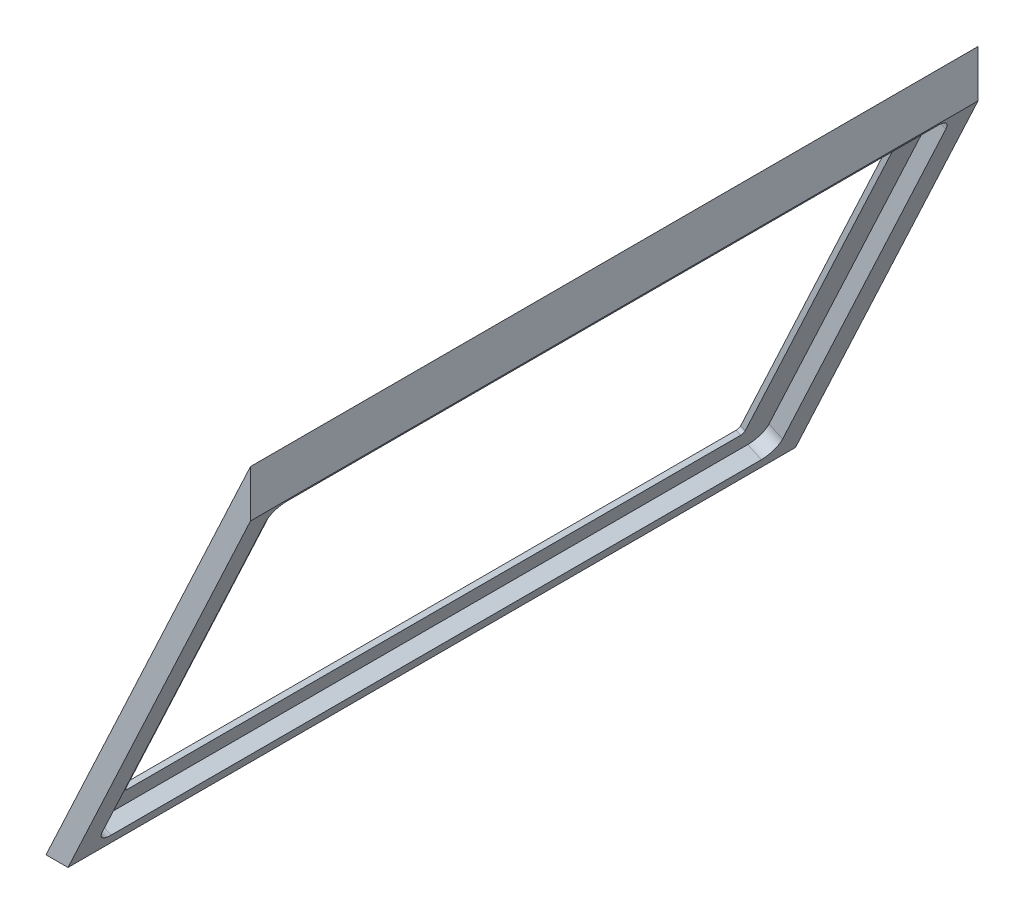
ISO-10303-21;
HEADER;
FILE_DESCRIPTION(('STEP AP214'),'2;1');
FILE_NAME('part.step','',(''),(''),'','','');
FILE_SCHEMA(('AUTOMOTIVE_DESIGN { 1 0 10303 214 1 1 1 1 }'));
ENDSEC;
DATA;
#1=APPLICATION_CONTEXT('core data for automotive mechanical design processes');
#2=APPLICATION_PROTOCOL_DEFINITION('international standard','automotive_design',2000,#1);
#3=PRODUCT_CONTEXT('',#1,'mechanical');
#4=PRODUCT('Part','Part','',(#3));
#5=PRODUCT_RELATED_PRODUCT_CATEGORY('part','',(#4));
#6=PRODUCT_DEFINITION_FORMATION('','',#4);
#7=PRODUCT_DEFINITION_CONTEXT('part definition',#1,'design');
#8=PRODUCT_DEFINITION('design','',#6,#7);
#9=PRODUCT_DEFINITION_SHAPE('','',#8);
#10=(LENGTH_UNIT() NAMED_UNIT(*) SI_UNIT(.MILLI.,.METRE.));
#11=(NAMED_UNIT(*) PLANE_ANGLE_UNIT() SI_UNIT($,.RADIAN.));
#12=(NAMED_UNIT(*) SI_UNIT($,.STERADIAN.) SOLID_ANGLE_UNIT());
#13=UNCERTAINTY_MEASURE_WITH_UNIT(LENGTH_MEASURE(1.E-05),#10,'distance_accuracy_value','');
#14=(GEOMETRIC_REPRESENTATION_CONTEXT(3) GLOBAL_UNCERTAINTY_ASSIGNED_CONTEXT((#13)) GLOBAL_UNIT_ASSIGNED_CONTEXT((#10,
#11,#12)) REPRESENTATION_CONTEXT('',''));
#15=CARTESIAN_POINT('',(0.,0.,0.));
#16=DIRECTION('',(0.,0.,1.));
#17=DIRECTION('',(1.,0.,0.));
#18=AXIS2_PLACEMENT_3D('',#15,#16,#17);
#19=CARTESIAN_POINT('',(60.2477013968429,-10.5015319165965,-97.6629999999999));
#20=DIRECTION('',(-0.906307787036651,0.422618261740697,0.));
#21=DIRECTION('',(-0.422618261740697,-0.906307787036651,0.));
#22=AXIS2_PLACEMENT_3D('',#19,#20,#21);
#23=CYLINDRICAL_SURFACE('',#22,1.016);
#24=CARTESIAN_POINT('',(8.17705624087686,13.7794086847018,-97.6629999999999));
#25=DIRECTION('',(0.906307787036651,-0.422618261740697,0.));
#26=DIRECTION('',(0.422618261740697,0.906307787036651,0.));
#27=AXIS2_PLACEMENT_3D('',#24,#25,#26);
#28=CIRCLE('',#27,1.016);
#29=CARTESIAN_POINT('',(8.17705624087686,13.7794086847018,-98.6789999999999));
#30=VERTEX_POINT('',#29);
#31=CARTESIAN_POINT('',(7.74767608694831,12.8585999730726,-97.6629999999999));
#32=VERTEX_POINT('',#31);
#33=EDGE_CURVE('E55',#30,#32,#28,.F.);
#34=ORIENTED_EDGE('',*,*,#33,.F.);
#35=DIRECTION('',(-0.906307787036651,0.422618261740697,0.));
#36=VECTOR('',#35,1.);
#37=CARTESIAN_POINT('',(60.2477013968429,-10.5015319165965,-98.6789999999999));
#38=LINE('',#37,#36);
#39=CARTESIAN_POINT('',(6.73829262895618,14.4503151752152,-98.6789999999999));
#40=VERTEX_POINT('',#39);
#41=EDGE_CURVE('E262',#30,#40,#38,.T.);
#42=ORIENTED_EDGE('',*,*,#41,.T.);
#43=CARTESIAN_POINT('',(6.73829262895618,14.4503151752152,-97.6629999999999));
#44=DIRECTION('',(-0.906307787036651,0.422618261740697,0.));
#45=DIRECTION('',(-0.422618261740697,-0.906307787036651,0.));
#46=AXIS2_PLACEMENT_3D('',#43,#44,#45);
#47=CIRCLE('',#46,1.016);
#48=CARTESIAN_POINT('',(6.30891247502763,13.5295064635859,-97.663));
#49=VERTEX_POINT('',#48);
#50=EDGE_CURVE('E237',#40,#49,#47,.T.);
#51=ORIENTED_EDGE('',*,*,#50,.T.);
#52=DIRECTION('',(-0.906307787036651,0.422618261740697,0.));
#53=VECTOR('',#52,1.);
#54=CARTESIAN_POINT('',(59.8183212429144,-11.4223406282257,-97.6629999999999));
#55=LINE('',#54,#53);
#56=EDGE_CURVE('E261',#32,#49,#55,.T.);
#57=ORIENTED_EDGE('',*,*,#56,.F.);
#58=EDGE_LOOP('',(#34,#42,#51,#57));
#59=FACE_BOUND('',#58,.T.);
#60=ADVANCED_FACE('F33',(#59),#23,.F.);
#61=CARTESIAN_POINT('',(60.2477013968429,-10.5015319165965,-98.6789999999999));
#62=DIRECTION('',(0.,0.,-1.));
#63=DIRECTION('',(0.,1.,0.));
#64=AXIS2_PLACEMENT_3D('',#61,#62,#63);
#65=PLANE('',#64);
#66=DIRECTION('',(-0.422618261740697,-0.906307787036651,0.));
#67=VECTOR('',#66,1.);
#68=CARTESIAN_POINT('',(8.17705624087686,13.7794086847018,-98.6789999999999));
#69=LINE('',#68,#67);
#70=CARTESIAN_POINT('',(55.8382533269457,115.989175675547,-98.679));
#71=VERTEX_POINT('',#70);
#72=EDGE_CURVE('E234',#71,#30,#69,.T.);
#73=ORIENTED_EDGE('',*,*,#72,.F.);
#74=DIRECTION('',(-0.906307787036651,0.422618261740697,0.));
#75=VECTOR('',#74,1.);
#76=CARTESIAN_POINT('',(107.908898482912,91.7082350742488,-98.679));
#77=LINE('',#76,#75);
#78=CARTESIAN_POINT('',(54.399489715025,116.66008216606,-98.679));
#79=VERTEX_POINT('',#78);
#80=EDGE_CURVE('E265',#71,#79,#77,.T.);
#81=ORIENTED_EDGE('',*,*,#80,.T.);
#82=DIRECTION('',(-0.422618261740697,-0.906307787036651,0.));
#83=VECTOR('',#82,1.);
#84=CARTESIAN_POINT('',(6.73829262895618,14.4503151752152,-98.6789999999999));
#85=LINE('',#84,#83);
#86=EDGE_CURVE('E258',#79,#40,#85,.T.);
#87=ORIENTED_EDGE('',*,*,#86,.T.);
#88=ORIENTED_EDGE('',*,*,#41,.F.);
#89=EDGE_LOOP('',(#73,#81,#87,#88));
#90=FACE_BOUND('',#89,.T.);
#91=ADVANCED_FACE('F336',(#90),#65,.F.);
#92=CARTESIAN_POINT('',(107.908898482912,91.7082350742488,-97.663));
#93=DIRECTION('',(-0.906307787036651,0.422618261740697,0.));
#94=DIRECTION('',(-0.422618261740697,-0.906307787036651,0.));
#95=AXIS2_PLACEMENT_3D('',#92,#93,#94);
#96=CYLINDRICAL_SURFACE('',#95,1.016);
#97=CARTESIAN_POINT('',(55.8382533269457,115.989175675547,-97.663));
#98=DIRECTION('',(0.906307787036651,-0.422618261740697,0.));
#99=DIRECTION('',(0.422618261740697,0.906307787036651,0.));
#100=AXIS2_PLACEMENT_3D('',#97,#98,#99);
#101=CIRCLE('',#100,1.016);
#102=CARTESIAN_POINT('',(56.2676334808742,116.909984387176,-97.663));
#103=VERTEX_POINT('',#102);
#104=EDGE_CURVE('E232',#103,#71,#101,.F.);
#105=ORIENTED_EDGE('',*,*,#104,.F.);
#106=DIRECTION('',(-0.906307787036651,0.422618261740697,0.));
#107=VECTOR('',#106,1.);
#108=CARTESIAN_POINT('',(108.33827863684,92.6290437858781,-97.663));
#109=LINE('',#108,#107);
#110=CARTESIAN_POINT('',(54.8288698689536,117.58089087769,-97.663));
#111=VERTEX_POINT('',#110);
#112=EDGE_CURVE('E267',#103,#111,#109,.T.);
#113=ORIENTED_EDGE('',*,*,#112,.T.);
#114=CARTESIAN_POINT('',(54.399489715025,116.66008216606,-97.663));
#115=DIRECTION('',(-0.906307787036651,0.422618261740697,0.));
#116=DIRECTION('',(-0.422618261740697,-0.906307787036651,0.));
#117=AXIS2_PLACEMENT_3D('',#114,#115,#116);
#118=CIRCLE('',#117,1.016);
#119=EDGE_CURVE('E255',#111,#79,#118,.T.);
#120=ORIENTED_EDGE('',*,*,#119,.T.);
#121=ORIENTED_EDGE('',*,*,#80,.F.);
#122=EDGE_LOOP('',(#105,#113,#120,#121));
#123=FACE_BOUND('',#122,.T.);
#124=ADVANCED_FACE('F341',(#123),#96,.F.);
#125=CARTESIAN_POINT('',(108.33827863684,92.6290437858781,-97.663));
#126=DIRECTION('',(0.422618261740697,0.906307787036651,0.));
#127=DIRECTION('',(-0.906307787036651,0.422618261740697,0.));
#128=AXIS2_PLACEMENT_3D('',#125,#126,#127);
#129=PLANE('',#128);
#130=DIRECTION('',(0.,0.,-1.));
#131=VECTOR('',#130,1.);
#132=CARTESIAN_POINT('',(56.2676334808742,116.909984387176,-97.663));
#133=LINE('',#132,#131);
#134=CARTESIAN_POINT('',(56.2676334808742,116.909984387176,97.663));
#135=VERTEX_POINT('',#134);
#136=EDGE_CURVE('E230',#135,#103,#133,.T.);
#137=ORIENTED_EDGE('',*,*,#136,.F.);
#138=DIRECTION('',(-0.906307787036651,0.422618261740697,0.));
#139=VECTOR('',#138,1.);
#140=CARTESIAN_POINT('',(108.33827863684,92.6290437858781,97.663));
#141=LINE('',#140,#139);
#142=CARTESIAN_POINT('',(54.8288698689536,117.58089087769,97.663));
#143=VERTEX_POINT('',#142);
#144=EDGE_CURVE('E269',#135,#143,#141,.T.);
#145=ORIENTED_EDGE('',*,*,#144,.T.);
#146=DIRECTION('',(0.,0.,-1.));
#147=VECTOR('',#146,1.);
#148=CARTESIAN_POINT('',(54.8288698689536,117.58089087769,-97.663));
#149=LINE('',#148,#147);
#150=EDGE_CURVE('E252',#143,#111,#149,.T.);
#151=ORIENTED_EDGE('',*,*,#150,.T.);
#152=ORIENTED_EDGE('',*,*,#112,.F.);
#153=EDGE_LOOP('',(#137,#145,#151,#152));
#154=FACE_BOUND('',#153,.T.);
#155=ADVANCED_FACE('F360',(#154),#129,.F.);
#156=CARTESIAN_POINT('',(107.908898482912,91.7082350742488,97.663));
#157=DIRECTION('',(-0.906307787036651,0.422618261740697,0.));
#158=DIRECTION('',(-0.422618261740697,-0.906307787036651,0.));
#159=AXIS2_PLACEMENT_3D('',#156,#157,#158);
#160=CYLINDRICAL_SURFACE('',#159,1.01599999999999);
#161=CARTESIAN_POINT('',(55.8382533269457,115.989175675547,97.663));
#162=DIRECTION('',(0.906307787036651,-0.422618261740697,0.));
#163=DIRECTION('',(0.422618261740697,0.906307787036651,0.));
#164=AXIS2_PLACEMENT_3D('',#161,#162,#163);
#165=CIRCLE('',#164,1.01599999999999);
#166=CARTESIAN_POINT('',(55.8382533269457,115.989175675547,98.679));
#167=VERTEX_POINT('',#166);
#168=EDGE_CURVE('E228',#167,#135,#165,.F.);
#169=ORIENTED_EDGE('',*,*,#168,.F.);
#170=DIRECTION('',(-0.906307787036651,0.422618261740697,0.));
#171=VECTOR('',#170,1.);
#172=CARTESIAN_POINT('',(107.908898482912,91.7082350742488,98.679));
#173=LINE('',#172,#171);
#174=CARTESIAN_POINT('',(54.399489715025,116.66008216606,98.679));
#175=VERTEX_POINT('',#174);
#176=EDGE_CURVE('E271',#167,#175,#173,.T.);
#177=ORIENTED_EDGE('',*,*,#176,.T.);
#178=CARTESIAN_POINT('',(54.399489715025,116.66008216606,97.663));
#179=DIRECTION('',(-0.906307787036651,0.422618261740697,0.));
#180=DIRECTION('',(-0.422618261740697,-0.906307787036651,0.));
#181=AXIS2_PLACEMENT_3D('',#178,#179,#180);
#182=CIRCLE('',#181,1.01599999999999);
#183=EDGE_CURVE('E249',#175,#143,#182,.T.);
#184=ORIENTED_EDGE('',*,*,#183,.T.);
#185=ORIENTED_EDGE('',*,*,#144,.F.);
#186=EDGE_LOOP('',(#169,#177,#184,#185));
#187=FACE_BOUND('',#186,.T.);
#188=ADVANCED_FACE('F356',(#187),#160,.F.);
#189=CARTESIAN_POINT('',(107.908898482912,91.7082350742488,98.679));
#190=DIRECTION('',(0.,0.,1.));
#191=DIRECTION('',(0.,-1.,0.));
#192=AXIS2_PLACEMENT_3D('',#189,#190,#191);
#193=PLANE('',#192);
#194=DIRECTION('',(0.422618261740697,0.906307787036651,0.));
#195=VECTOR('',#194,1.);
#196=CARTESIAN_POINT('',(55.8382533269457,115.989175675547,98.679));
#197=LINE('',#196,#195);
#198=CARTESIAN_POINT('',(8.17705624087685,13.7794086847018,98.6789999999999));
#199=VERTEX_POINT('',#198);
#200=EDGE_CURVE('E226',#199,#167,#197,.T.);
#201=ORIENTED_EDGE('',*,*,#200,.F.);
#202=DIRECTION('',(-0.906307787036651,0.422618261740697,0.));
#203=VECTOR('',#202,1.);
#204=CARTESIAN_POINT('',(60.2477013968429,-10.5015319165965,98.6789999999999));
#205=LINE('',#204,#203);
#206=CARTESIAN_POINT('',(6.73829262895617,14.4503151752152,98.6789999999999));
#207=VERTEX_POINT('',#206);
#208=EDGE_CURVE('E273',#199,#207,#205,.T.);
#209=ORIENTED_EDGE('',*,*,#208,.T.);
#210=DIRECTION('',(0.422618261740697,0.906307787036651,0.));
#211=VECTOR('',#210,1.);
#212=CARTESIAN_POINT('',(54.399489715025,116.66008216606,98.679));
#213=LINE('',#212,#211);
#214=EDGE_CURVE('E246',#207,#175,#213,.T.);
#215=ORIENTED_EDGE('',*,*,#214,.T.);
#216=ORIENTED_EDGE('',*,*,#176,.F.);
#217=EDGE_LOOP('',(#201,#209,#215,#216));
#218=FACE_BOUND('',#217,.T.);
#219=ADVANCED_FACE('F352',(#218),#193,.F.);
#220=CARTESIAN_POINT('',(60.2477013968429,-10.5015319165965,97.6629999999999));
#221=DIRECTION('',(-0.906307787036651,0.422618261740697,0.));
#222=DIRECTION('',(-0.422618261740697,-0.906307787036651,0.));
#223=AXIS2_PLACEMENT_3D('',#220,#221,#222);
#224=CYLINDRICAL_SURFACE('',#223,1.016);
#225=CARTESIAN_POINT('',(8.17705624087685,13.7794086847018,97.6629999999999));
#226=DIRECTION('',(0.906307787036651,-0.422618261740697,0.));
#227=DIRECTION('',(0.422618261740697,0.906307787036651,0.));
#228=AXIS2_PLACEMENT_3D('',#225,#226,#227);
#229=CIRCLE('',#228,1.016);
#230=CARTESIAN_POINT('',(7.74767608694831,12.8585999730726,97.6629999999999));
#231=VERTEX_POINT('',#230);
#232=EDGE_CURVE('E224',#231,#199,#229,.F.);
#233=ORIENTED_EDGE('',*,*,#232,.F.);
#234=DIRECTION('',(-0.906307787036651,0.422618261740697,0.));
#235=VECTOR('',#234,1.);
#236=CARTESIAN_POINT('',(59.8183212429144,-11.4223406282257,97.6629999999999));
#237=LINE('',#236,#235);
#238=CARTESIAN_POINT('',(6.30891247502763,13.5295064635859,97.6629999999999));
#239=VERTEX_POINT('',#238);
#240=EDGE_CURVE('E275',#231,#239,#237,.T.);
#241=ORIENTED_EDGE('',*,*,#240,.T.);
#242=CARTESIAN_POINT('',(6.73829262895617,14.4503151752152,97.6629999999999));
#243=DIRECTION('',(-0.906307787036651,0.422618261740697,0.));
#244=DIRECTION('',(-0.422618261740697,-0.906307787036651,0.));
#245=AXIS2_PLACEMENT_3D('',#242,#243,#244);
#246=CIRCLE('',#245,1.016);
#247=EDGE_CURVE('E243',#239,#207,#246,.T.);
#248=ORIENTED_EDGE('',*,*,#247,.T.);
#249=ORIENTED_EDGE('',*,*,#208,.F.);
#250=EDGE_LOOP('',(#233,#241,#248,#249));
#251=FACE_BOUND('',#250,.T.);
#252=ADVANCED_FACE('F348',(#251),#224,.F.);
#253=CARTESIAN_POINT('',(59.8183212429144,-11.4223406282257,97.6629999999999));
#254=DIRECTION('',(-0.422618261740697,-0.906307787036651,0.));
#255=DIRECTION('',(0.906307787036651,-0.422618261740697,0.));
#256=AXIS2_PLACEMENT_3D('',#253,#254,#255);
#257=PLANE('',#256);
#258=DIRECTION('',(0.,0.,1.));
#259=VECTOR('',#258,1.);
#260=CARTESIAN_POINT('',(7.74767608694831,12.8585999730726,97.6629999999999));
#261=LINE('',#260,#259);
#262=EDGE_CURVE('E12',#32,#231,#261,.T.);
#263=ORIENTED_EDGE('',*,*,#262,.F.);
#264=ORIENTED_EDGE('',*,*,#56,.T.);
#265=DIRECTION('',(0.,0.,1.));
#266=VECTOR('',#265,1.);
#267=CARTESIAN_POINT('',(6.30891247502763,13.5295064635859,97.6629999999999));
#268=LINE('',#267,#266);
#269=EDGE_CURVE('E240',#49,#239,#268,.T.);
#270=ORIENTED_EDGE('',*,*,#269,.T.);
#271=ORIENTED_EDGE('',*,*,#240,.F.);
#272=EDGE_LOOP('',(#263,#264,#270,#271));
#273=FACE_BOUND('',#272,.T.);
#274=ADVANCED_FACE('F345',(#273),#257,.F.);
#275=CARTESIAN_POINT('',(7.0064497854118,0.,115.8875));
#276=DIRECTION('',(0.,1.,0.));
#277=DIRECTION('',(-1.,0.,0.));
#278=AXIS2_PLACEMENT_3D('',#275,#276,#277);
#279=PLANE('',#278);
#280=DIRECTION('',(1.,0.,0.));
#281=VECTOR('',#280,1.);
#282=CARTESIAN_POINT('',(7.0064497854118,0.,-115.8875));
#283=LINE('',#282,#281);
#284=CARTESIAN_POINT('',(0.,0.,-115.8875));
#285=VERTEX_POINT('',#284);
#286=CARTESIAN_POINT('',(7.0064497854118,0.,-115.8875));
#287=VERTEX_POINT('',#286);
#288=EDGE_CURVE('E264',#285,#287,#283,.T.);
#289=ORIENTED_EDGE('',*,*,#288,.T.);
#290=DIRECTION('',(0.,0.,-1.));
#291=VECTOR('',#290,1.);
#292=CARTESIAN_POINT('',(7.0064497854118,0.,115.8875));
#293=LINE('',#292,#291);
#294=CARTESIAN_POINT('',(7.0064497854118,0.,115.8875));
#295=VERTEX_POINT('',#294);
#296=EDGE_CURVE('E41',#295,#287,#293,.T.);
#297=ORIENTED_EDGE('',*,*,#296,.F.);
#298=DIRECTION('',(1.,0.,0.));
#299=VECTOR('',#298,1.);
#300=CARTESIAN_POINT('',(7.0064497854118,0.,115.8875));
#301=LINE('',#300,#299);
#302=CARTESIAN_POINT('',(0.,0.,115.8875));
#303=VERTEX_POINT('',#302);
#304=EDGE_CURVE('E278',#303,#295,#301,.T.);
#305=ORIENTED_EDGE('',*,*,#304,.F.);
#306=DIRECTION('',(0.,0.,-1.));
#307=VECTOR('',#306,1.);
#308=CARTESIAN_POINT('',(0.,0.,115.8875));
#309=LINE('',#308,#307);
#310=EDGE_CURVE('E288',#303,#285,#309,.T.);
#311=ORIENTED_EDGE('',*,*,#310,.T.);
#312=EDGE_LOOP('',(#289,#297,#305,#311));
#313=FACE_BOUND('',#312,.T.);
#314=ADVANCED_FACE('F35',(#313),#279,.F.);
#315=CARTESIAN_POINT('',(65.1431798442528,124.674619946982,115.8875));
#316=DIRECTION('',(-0.906307787036651,0.422618261740697,0.));
#317=DIRECTION('',(-0.422618261740697,-0.906307787036651,0.));
#318=AXIS2_PLACEMENT_3D('',#315,#316,#317);
#319=PLANE('',#318);
#320=CARTESIAN_POINT('',(62.8234101819699,119.699857852228,-103.1875));
#321=DIRECTION('',(0.906307787036651,-0.422618261740697,0.));
#322=DIRECTION('',(0.422618261740697,0.906307787036651,0.));
#323=AXIS2_PLACEMENT_3D('',#320,#321,#322);
#324=CIRCLE('',#323,4.7625);
#325=CARTESIAN_POINT('',(62.8234101819699,119.699857852228,-107.95));
#326=VERTEX_POINT('',#325);
#327=CARTESIAN_POINT('',(64.83612965351,124.01614868799,-103.1875));
#328=VERTEX_POINT('',#327);
#329=EDGE_CURVE('E193',#326,#328,#324,.T.);
#330=ORIENTED_EDGE('',*,*,#329,.F.);
#331=DIRECTION('',(0.422618261740697,0.906307787036651,0.));
#332=VECTOR('',#331,1.);
#333=CARTESIAN_POINT('',(10.8281571671848,8.19567792837461,-107.95));
#334=LINE('',#333,#332);
#335=CARTESIAN_POINT('',(10.8281571671848,8.19567792837461,-107.95));
#336=VERTEX_POINT('',#335);
#337=EDGE_CURVE('E175',#336,#326,#334,.T.);
#338=ORIENTED_EDGE('',*,*,#337,.F.);
#339=CARTESIAN_POINT('',(10.8281571671847,8.19567792837459,-103.1875));
#340=DIRECTION('',(0.906307787036651,-0.422618261740697,0.));
#341=DIRECTION('',(0.422618261740697,0.906307787036651,0.));
#342=AXIS2_PLACEMENT_3D('',#339,#340,#341);
#343=CIRCLE('',#342,4.7625);
#344=CARTESIAN_POINT('',(8.81543769564467,3.87938709261253,-103.1875));
#345=VERTEX_POINT('',#344);
#346=EDGE_CURVE('E184',#345,#336,#343,.T.);
#347=ORIENTED_EDGE('',*,*,#346,.F.);
#348=DIRECTION('',(0.,0.,-1.));
#349=VECTOR('',#348,1.);
#350=CARTESIAN_POINT('',(8.81543769564466,3.87938709261252,103.98125));
#351=LINE('',#350,#349);
#352=CARTESIAN_POINT('',(8.81543769564466,3.87938709261252,103.98125));
#353=VERTEX_POINT('',#352);
#354=EDGE_CURVE('E48',#353,#345,#351,.T.);
#355=ORIENTED_EDGE('',*,*,#354,.F.);
#356=CARTESIAN_POINT('',(10.8281571671847,8.19567792837458,103.98125));
#357=DIRECTION('',(0.906307787036651,-0.422618261740697,0.));
#358=DIRECTION('',(0.422618261740697,0.906307787036651,0.));
#359=AXIS2_PLACEMENT_3D('',#356,#357,#358);
#360=CIRCLE('',#359,4.76250000000001);
#361=CARTESIAN_POINT('',(10.8281571671847,8.19567792837458,108.74375));
#362=VERTEX_POINT('',#361);
#363=EDGE_CURVE('E207',#362,#353,#360,.T.);
#364=ORIENTED_EDGE('',*,*,#363,.F.);
#365=DIRECTION('',(-0.422618261740697,-0.906307787036651,0.));
#366=VECTOR('',#365,1.);
#367=CARTESIAN_POINT('',(10.8281571671847,8.19567792837458,108.74375));
#368=LINE('',#367,#366);
#369=CARTESIAN_POINT('',(62.8234101819699,119.699857852228,108.74375));
#370=VERTEX_POINT('',#369);
#371=EDGE_CURVE('E204',#370,#362,#368,.T.);
#372=ORIENTED_EDGE('',*,*,#371,.F.);
#373=CARTESIAN_POINT('',(62.8234101819699,119.699857852228,103.98125));
#374=DIRECTION('',(0.906307787036651,-0.422618261740697,0.));
#375=DIRECTION('',(0.422618261740697,0.906307787036651,0.));
#376=AXIS2_PLACEMENT_3D('',#373,#374,#375);
#377=CIRCLE('',#376,4.7625);
#378=CARTESIAN_POINT('',(64.83612965351,124.01614868799,103.98125));
#379=VERTEX_POINT('',#378);
#380=EDGE_CURVE('E201',#379,#370,#377,.T.);
#381=ORIENTED_EDGE('',*,*,#380,.F.);
#382=DIRECTION('',(0.,0.,1.));
#383=VECTOR('',#382,1.);
#384=CARTESIAN_POINT('',(64.83612965351,124.01614868799,-103.1875));
#385=LINE('',#384,#383);
#386=EDGE_CURVE('E195',#328,#379,#385,.T.);
#387=ORIENTED_EDGE('',*,*,#386,.F.);
#388=EDGE_LOOP('',(#330,#338,#347,#355,#364,#372,#381,#387));
#389=FACE_BOUND('',#388,.T.);
#390=DIRECTION('',(0.422618261740697,0.906307787036651,0.));
#391=VECTOR('',#390,1.);
#392=CARTESIAN_POINT('',(65.1431798442528,124.674619946982,-115.8875));
#393=LINE('',#392,#391);
#394=CARTESIAN_POINT('',(65.1431798442528,124.674619946982,-115.8875));
#395=VERTEX_POINT('',#394);
#396=EDGE_CURVE('E291',#287,#395,#393,.T.);
#397=ORIENTED_EDGE('',*,*,#396,.T.);
#398=DIRECTION('',(0.,0.,-1.));
#399=VECTOR('',#398,1.);
#400=CARTESIAN_POINT('',(65.1431798442528,124.674619946982,115.8875));
#401=LINE('',#400,#399);
#402=CARTESIAN_POINT('',(65.1431798442528,124.674619946982,115.8875));
#403=VERTEX_POINT('',#402);
#404=EDGE_CURVE('E301',#403,#395,#401,.T.);
#405=ORIENTED_EDGE('',*,*,#404,.F.);
#406=DIRECTION('',(0.422618261740697,0.906307787036651,0.));
#407=VECTOR('',#406,1.);
#408=CARTESIAN_POINT('',(65.1431798442528,124.674619946982,115.8875));
#409=LINE('',#408,#407);
#410=EDGE_CURVE('E281',#295,#403,#409,.T.);
#411=ORIENTED_EDGE('',*,*,#410,.F.);
#412=ORIENTED_EDGE('',*,*,#296,.T.);
#413=EDGE_LOOP('',(#397,#405,#411,#412));
#414=FACE_BOUND('',#413,.T.);
#415=ADVANCED_FACE('F189',(#389,#414),#319,.F.);
#416=CARTESIAN_POINT('',(65.1431798442528,139.7,115.8875));
#417=DIRECTION('',(-1.,0.,0.));
#418=DIRECTION('',(0.,0.,1.));
#419=AXIS2_PLACEMENT_3D('',#416,#417,#418);
#420=PLANE('',#419);
#421=DIRECTION('',(0.,1.,0.));
#422=VECTOR('',#421,1.);
#423=CARTESIAN_POINT('',(65.1431798442528,139.7,-115.8875));
#424=LINE('',#423,#422);
#425=CARTESIAN_POINT('',(65.1431798442528,139.7,-115.8875));
#426=VERTEX_POINT('',#425);
#427=EDGE_CURVE('E293',#395,#426,#424,.T.);
#428=ORIENTED_EDGE('',*,*,#427,.T.);
#429=DIRECTION('',(0.,0.,-1.));
#430=VECTOR('',#429,1.);
#431=CARTESIAN_POINT('',(65.1431798442528,139.7,115.8875));
#432=LINE('',#431,#430);
#433=CARTESIAN_POINT('',(65.1431798442528,139.7,115.8875));
#434=VERTEX_POINT('',#433);
#435=EDGE_CURVE('E298',#434,#426,#432,.T.);
#436=ORIENTED_EDGE('',*,*,#435,.F.);
#437=DIRECTION('',(0.,1.,0.));
#438=VECTOR('',#437,1.);
#439=CARTESIAN_POINT('',(65.1431798442528,139.7,115.8875));
#440=LINE('',#439,#438);
#441=EDGE_CURVE('E284',#403,#434,#440,.T.);
#442=ORIENTED_EDGE('',*,*,#441,.F.);
#443=ORIENTED_EDGE('',*,*,#404,.T.);
#444=EDGE_LOOP('',(#428,#436,#442,#443));
#445=FACE_BOUND('',#444,.T.);
#446=ADVANCED_FACE('F316',(#445),#420,.F.);
#447=CARTESIAN_POINT('',(0.,0.,115.8875));
#448=DIRECTION('',(0.906307787036651,-0.422618261740697,0.));
#449=DIRECTION('',(0.422618261740697,0.906307787036651,0.));
#450=AXIS2_PLACEMENT_3D('',#447,#448,#449);
#451=PLANE('',#450);
#452=ORIENTED_EDGE('',*,*,#269,.F.);
#453=ORIENTED_EDGE('',*,*,#50,.F.);
#454=ORIENTED_EDGE('',*,*,#86,.F.);
#455=ORIENTED_EDGE('',*,*,#119,.F.);
#456=ORIENTED_EDGE('',*,*,#150,.F.);
#457=ORIENTED_EDGE('',*,*,#183,.F.);
#458=ORIENTED_EDGE('',*,*,#214,.F.);
#459=ORIENTED_EDGE('',*,*,#247,.F.);
#460=EDGE_LOOP('',(#452,#453,#454,#455,#456,#457,#458,#459));
#461=FACE_BOUND('',#460,.T.);
#462=DIRECTION('',(-0.422618261740697,-0.906307787036651,0.));
#463=VECTOR('',#462,1.);
#464=CARTESIAN_POINT('',(0.,0.,-115.8875));
#465=LINE('',#464,#463);
#466=EDGE_CURVE('E282',#426,#285,#465,.T.);
#467=ORIENTED_EDGE('',*,*,#466,.T.);
#468=ORIENTED_EDGE('',*,*,#310,.F.);
#469=DIRECTION('',(-0.422618261740697,-0.906307787036651,0.));
#470=VECTOR('',#469,1.);
#471=CARTESIAN_POINT('',(0.,0.,115.8875));
#472=LINE('',#471,#470);
#473=EDGE_CURVE('E286',#434,#303,#472,.T.);
#474=ORIENTED_EDGE('',*,*,#473,.F.);
#475=ORIENTED_EDGE('',*,*,#435,.T.);
#476=EDGE_LOOP('',(#467,#468,#474,#475));
#477=FACE_BOUND('',#476,.T.);
#478=ADVANCED_FACE('F320',(#461,#477),#451,.F.);
#479=CARTESIAN_POINT('',(65.1431798442528,0.,115.8875));
#480=DIRECTION('',(0.,0.,1.));
#481=DIRECTION('',(1.,0.,0.));
#482=AXIS2_PLACEMENT_3D('',#479,#480,#481);
#483=PLANE('',#482);
#484=ORIENTED_EDGE('',*,*,#304,.T.);
#485=ORIENTED_EDGE('',*,*,#410,.T.);
#486=ORIENTED_EDGE('',*,*,#441,.T.);
#487=ORIENTED_EDGE('',*,*,#473,.T.);
#488=EDGE_LOOP('',(#484,#485,#486,#487));
#489=FACE_BOUND('',#488,.T.);
#490=ADVANCED_FACE('F322',(#489),#483,.T.);
#491=CARTESIAN_POINT('',(65.1431798442528,0.,-115.8875));
#492=DIRECTION('',(0.,0.,1.));
#493=DIRECTION('',(1.,0.,0.));
#494=AXIS2_PLACEMENT_3D('',#491,#492,#493);
#495=PLANE('',#494);
#496=ORIENTED_EDGE('',*,*,#288,.F.);
#497=ORIENTED_EDGE('',*,*,#466,.F.);
#498=ORIENTED_EDGE('',*,*,#427,.F.);
#499=ORIENTED_EDGE('',*,*,#396,.F.);
#500=EDGE_LOOP('',(#496,#497,#498,#499));
#501=FACE_BOUND('',#500,.T.);
#502=ADVANCED_FACE('F312',(#501),#495,.F.);
#503=CARTESIAN_POINT('',(1.43876361192068,-0.670906490513357,115.8875));
#504=DIRECTION('',(0.906307787036651,-0.422618261740697,0.));
#505=DIRECTION('',(0.422618261740697,0.906307787036651,0.));
#506=AXIS2_PLACEMENT_3D('',#503,#504,#505);
#507=PLANE('',#506);
#508=ORIENTED_EDGE('',*,*,#33,.T.);
#509=ORIENTED_EDGE('',*,*,#262,.T.);
#510=ORIENTED_EDGE('',*,*,#232,.T.);
#511=ORIENTED_EDGE('',*,*,#200,.T.);
#512=ORIENTED_EDGE('',*,*,#168,.T.);
#513=ORIENTED_EDGE('',*,*,#136,.T.);
#514=ORIENTED_EDGE('',*,*,#104,.T.);
#515=ORIENTED_EDGE('',*,*,#72,.T.);
#516=EDGE_LOOP('',(#508,#509,#510,#511,#512,#513,#514,#515));
#517=FACE_BOUND('',#516,.T.);
#518=CARTESIAN_POINT('',(6.5118663314227,10.2083973999147,-103.1875));
#519=DIRECTION('',(0.906307787036651,-0.422618261740697,0.));
#520=DIRECTION('',(0.422618261740697,0.906307787036651,0.));
#521=AXIS2_PLACEMENT_3D('',#518,#519,#520);
#522=CIRCLE('',#521,4.7625);
#523=CARTESIAN_POINT('',(6.51186633142272,10.2083973999147,-107.95));
#524=VERTEX_POINT('',#523);
#525=CARTESIAN_POINT('',(4.4991468598826,5.89210656415262,-103.1875));
#526=VERTEX_POINT('',#525);
#527=EDGE_CURVE('E403',#524,#526,#522,.F.);
#528=ORIENTED_EDGE('',*,*,#527,.F.);
#529=DIRECTION('',(-0.422618261740697,-0.906307787036651,0.));
#530=VECTOR('',#529,1.);
#531=CARTESIAN_POINT('',(6.51186633142273,10.2083973999147,-107.95));
#532=LINE('',#531,#530);
#533=CARTESIAN_POINT('',(58.5071193462079,121.712577323768,-107.95));
#534=VERTEX_POINT('',#533);
#535=EDGE_CURVE('E178',#534,#524,#532,.T.);
#536=ORIENTED_EDGE('',*,*,#535,.F.);
#537=CARTESIAN_POINT('',(58.5071193462079,121.712577323768,-103.1875));
#538=DIRECTION('',(0.906307787036651,-0.422618261740697,0.));
#539=DIRECTION('',(0.422618261740697,0.906307787036651,0.));
#540=AXIS2_PLACEMENT_3D('',#537,#538,#539);
#541=CIRCLE('',#540,4.7625);
#542=CARTESIAN_POINT('',(60.5198388177479,126.02886815953,-103.1875));
#543=VERTEX_POINT('',#542);
#544=EDGE_CURVE('E212',#543,#534,#541,.F.);
#545=ORIENTED_EDGE('',*,*,#544,.F.);
#546=DIRECTION('',(0.,0.,-1.));
#547=VECTOR('',#546,1.);
#548=CARTESIAN_POINT('',(60.5198388177479,126.02886815953,-103.1875));
#549=LINE('',#548,#547);
#550=CARTESIAN_POINT('',(60.5198388177479,126.02886815953,103.98125));
#551=VERTEX_POINT('',#550);
#552=EDGE_CURVE('E419',#551,#543,#549,.T.);
#553=ORIENTED_EDGE('',*,*,#552,.F.);
#554=CARTESIAN_POINT('',(58.5071193462079,121.712577323768,103.98125));
#555=DIRECTION('',(0.906307787036651,-0.422618261740697,0.));
#556=DIRECTION('',(0.422618261740697,0.906307787036651,0.));
#557=AXIS2_PLACEMENT_3D('',#554,#555,#556);
#558=CIRCLE('',#557,4.7625);
#559=CARTESIAN_POINT('',(58.5071193462079,121.712577323768,108.74375));
#560=VERTEX_POINT('',#559);
#561=EDGE_CURVE('E416',#560,#551,#558,.F.);
#562=ORIENTED_EDGE('',*,*,#561,.F.);
#563=DIRECTION('',(0.422618261740697,0.906307787036651,0.));
#564=VECTOR('',#563,1.);
#565=CARTESIAN_POINT('',(6.5118663314227,10.2083973999147,108.74375));
#566=LINE('',#565,#564);
#567=CARTESIAN_POINT('',(6.51186633142269,10.2083973999146,108.74375));
#568=VERTEX_POINT('',#567);
#569=EDGE_CURVE('E408',#568,#560,#566,.T.);
#570=ORIENTED_EDGE('',*,*,#569,.F.);
#571=CARTESIAN_POINT('',(6.5118663314227,10.2083973999146,103.98125));
#572=DIRECTION('',(0.906307787036651,-0.422618261740697,0.));
#573=DIRECTION('',(0.422618261740697,0.906307787036651,0.));
#574=AXIS2_PLACEMENT_3D('',#571,#572,#573);
#575=CIRCLE('',#574,4.76250000000001);
#576=CARTESIAN_POINT('',(4.49914685988262,5.89210656415259,103.98125));
#577=VERTEX_POINT('',#576);
#578=EDGE_CURVE('E404',#577,#568,#575,.F.);
#579=ORIENTED_EDGE('',*,*,#578,.F.);
#580=DIRECTION('',(0.,0.,1.));
#581=VECTOR('',#580,1.);
#582=CARTESIAN_POINT('',(4.49914685988259,5.89210656415261,103.98125));
#583=LINE('',#582,#581);
#584=EDGE_CURVE('E399',#526,#577,#583,.T.);
#585=ORIENTED_EDGE('',*,*,#584,.F.);
#586=EDGE_LOOP('',(#528,#536,#545,#553,#562,#570,#579,#585));
#587=FACE_BOUND('',#586,.T.);
#588=ADVANCED_FACE('F329',(#517,#587),#507,.T.);
#589=CARTESIAN_POINT('',(-223.710543300129,117.562870090004,-107.95));
#590=DIRECTION('',(0.,0.,-1.));
#591=DIRECTION('',(-1.,0.,0.));
#592=AXIS2_PLACEMENT_3D('',#589,#590,#591);
#593=PLANE('',#592);
#594=ORIENTED_EDGE('',*,*,#535,.T.);
#595=DIRECTION('',(0.906307787036651,-0.422618261740697,0.));
#596=VECTOR('',#595,1.);
#597=CARTESIAN_POINT('',(-223.710543300129,117.562870090004,-107.95));
#598=LINE('',#597,#596);
#599=EDGE_CURVE('E170',#524,#336,#598,.T.);
#600=ORIENTED_EDGE('',*,*,#599,.T.);
#601=ORIENTED_EDGE('',*,*,#337,.T.);
#602=DIRECTION('',(0.906307787036651,-0.422618261740697,0.));
#603=VECTOR('',#602,1.);
#604=CARTESIAN_POINT('',(-171.715290285344,229.067050013857,-107.95));
#605=LINE('',#604,#603);
#606=EDGE_CURVE('E181',#534,#326,#605,.T.);
#607=ORIENTED_EDGE('',*,*,#606,.F.);
#608=EDGE_LOOP('',(#594,#600,#601,#607));
#609=FACE_BOUND('',#608,.T.);
#610=ADVANCED_FACE('F172',(#609),#593,.F.);
#611=CARTESIAN_POINT('',(-171.715290285344,229.067050013857,-103.1875));
#612=DIRECTION('',(0.906307787036651,-0.422618261740697,0.));
#613=DIRECTION('',(0.422618261740697,0.906307787036651,0.));
#614=AXIS2_PLACEMENT_3D('',#611,#612,#613);
#615=CYLINDRICAL_SURFACE('',#614,4.7625);
#616=ORIENTED_EDGE('',*,*,#544,.T.);
#617=ORIENTED_EDGE('',*,*,#606,.T.);
#618=ORIENTED_EDGE('',*,*,#329,.T.);
#619=DIRECTION('',(0.906307787036651,-0.422618261740697,0.));
#620=VECTOR('',#619,1.);
#621=CARTESIAN_POINT('',(-169.702570813804,233.383340849619,-103.1875));
#622=LINE('',#621,#620);
#623=EDGE_CURVE('E221',#543,#328,#622,.T.);
#624=ORIENTED_EDGE('',*,*,#623,.F.);
#625=EDGE_LOOP('',(#616,#617,#618,#624));
#626=FACE_BOUND('',#625,.T.);
#627=ADVANCED_FACE('F375',(#626),#615,.F.);
#628=CARTESIAN_POINT('',(-169.702570813804,233.383340849619,-103.1875));
#629=DIRECTION('',(0.422618261740697,0.906307787036651,0.));
#630=DIRECTION('',(-0.906307787036651,0.422618261740697,0.));
#631=AXIS2_PLACEMENT_3D('',#628,#629,#630);
#632=PLANE('',#631);
#633=ORIENTED_EDGE('',*,*,#552,.T.);
#634=ORIENTED_EDGE('',*,*,#623,.T.);
#635=ORIENTED_EDGE('',*,*,#386,.T.);
#636=DIRECTION('',(0.906307787036651,-0.422618261740697,0.));
#637=VECTOR('',#636,1.);
#638=CARTESIAN_POINT('',(-169.702570813804,233.383340849619,103.98125));
#639=LINE('',#638,#637);
#640=EDGE_CURVE('E219',#551,#379,#639,.T.);
#641=ORIENTED_EDGE('',*,*,#640,.F.);
#642=EDGE_LOOP('',(#633,#634,#635,#641));
#643=FACE_BOUND('',#642,.T.);
#644=ADVANCED_FACE('F378',(#643),#632,.F.);
#645=CARTESIAN_POINT('',(-171.715290285344,229.067050013857,103.98125));
#646=DIRECTION('',(0.906307787036651,-0.422618261740697,0.));
#647=DIRECTION('',(0.422618261740697,0.906307787036651,0.));
#648=AXIS2_PLACEMENT_3D('',#645,#646,#647);
#649=CYLINDRICAL_SURFACE('',#648,4.7625);
#650=ORIENTED_EDGE('',*,*,#561,.T.);
#651=ORIENTED_EDGE('',*,*,#640,.T.);
#652=ORIENTED_EDGE('',*,*,#380,.T.);
#653=DIRECTION('',(0.906307787036651,-0.422618261740697,0.));
#654=VECTOR('',#653,1.);
#655=CARTESIAN_POINT('',(-171.715290285344,229.067050013857,108.74375));
#656=LINE('',#655,#654);
#657=EDGE_CURVE('E217',#560,#370,#656,.T.);
#658=ORIENTED_EDGE('',*,*,#657,.F.);
#659=EDGE_LOOP('',(#650,#651,#652,#658));
#660=FACE_BOUND('',#659,.T.);
#661=ADVANCED_FACE('F382',(#660),#649,.F.);
#662=CARTESIAN_POINT('',(-223.710543300129,117.562870090004,108.74375));
#663=DIRECTION('',(0.,0.,1.));
#664=DIRECTION('',(1.,0.,0.));
#665=AXIS2_PLACEMENT_3D('',#662,#663,#664);
#666=PLANE('',#665);
#667=ORIENTED_EDGE('',*,*,#569,.T.);
#668=ORIENTED_EDGE('',*,*,#657,.T.);
#669=ORIENTED_EDGE('',*,*,#371,.T.);
#670=DIRECTION('',(0.906307787036651,-0.422618261740697,0.));
#671=VECTOR('',#670,1.);
#672=CARTESIAN_POINT('',(-223.710543300129,117.562870090004,108.74375));
#673=LINE('',#672,#671);
#674=EDGE_CURVE('E215',#568,#362,#673,.T.);
#675=ORIENTED_EDGE('',*,*,#674,.F.);
#676=EDGE_LOOP('',(#667,#668,#669,#675));
#677=FACE_BOUND('',#676,.T.);
#678=ADVANCED_FACE('F386',(#677),#666,.F.);
#679=CARTESIAN_POINT('',(-223.710543300129,117.562870090004,103.98125));
#680=DIRECTION('',(0.906307787036651,-0.422618261740697,0.));
#681=DIRECTION('',(0.422618261740697,0.906307787036651,0.));
#682=AXIS2_PLACEMENT_3D('',#679,#680,#681);
#683=CYLINDRICAL_SURFACE('',#682,4.76250000000001);
#684=ORIENTED_EDGE('',*,*,#578,.T.);
#685=ORIENTED_EDGE('',*,*,#674,.T.);
#686=ORIENTED_EDGE('',*,*,#363,.T.);
#687=DIRECTION('',(0.906307787036651,-0.422618261740697,0.));
#688=VECTOR('',#687,1.);
#689=CARTESIAN_POINT('',(-225.723262771669,113.246579254242,103.98125));
#690=LINE('',#689,#688);
#691=EDGE_CURVE('E213',#577,#353,#690,.T.);
#692=ORIENTED_EDGE('',*,*,#691,.F.);
#693=EDGE_LOOP('',(#684,#685,#686,#692));
#694=FACE_BOUND('',#693,.T.);
#695=ADVANCED_FACE('F390',(#694),#683,.F.);
#696=CARTESIAN_POINT('',(-225.723262771669,113.246579254242,103.98125));
#697=DIRECTION('',(-0.422618261740697,-0.906307787036651,0.));
#698=DIRECTION('',(0.906307787036651,-0.422618261740697,0.));
#699=AXIS2_PLACEMENT_3D('',#696,#697,#698);
#700=PLANE('',#699);
#701=ORIENTED_EDGE('',*,*,#584,.T.);
#702=ORIENTED_EDGE('',*,*,#691,.T.);
#703=ORIENTED_EDGE('',*,*,#354,.T.);
#704=DIRECTION('',(0.906307787036651,-0.422618261740697,0.));
#705=VECTOR('',#704,1.);
#706=CARTESIAN_POINT('',(-225.723262771669,113.246579254242,-103.1875));
#707=LINE('',#706,#705);
#708=EDGE_CURVE('E186',#526,#345,#707,.T.);
#709=ORIENTED_EDGE('',*,*,#708,.F.);
#710=EDGE_LOOP('',(#701,#702,#703,#709));
#711=FACE_BOUND('',#710,.T.);
#712=ADVANCED_FACE('F372',(#711),#700,.F.);
#713=CARTESIAN_POINT('',(-223.710543300129,117.562870090004,-103.1875));
#714=DIRECTION('',(0.906307787036651,-0.422618261740697,0.));
#715=DIRECTION('',(0.422618261740697,0.906307787036651,0.));
#716=AXIS2_PLACEMENT_3D('',#713,#714,#715);
#717=CYLINDRICAL_SURFACE('',#716,4.7625);
#718=ORIENTED_EDGE('',*,*,#527,.T.);
#719=ORIENTED_EDGE('',*,*,#708,.T.);
#720=ORIENTED_EDGE('',*,*,#346,.T.);
#721=ORIENTED_EDGE('',*,*,#599,.F.);
#722=EDGE_LOOP('',(#718,#719,#720,#721));
#723=FACE_BOUND('',#722,.T.);
#724=ADVANCED_FACE('F185',(#723),#717,.F.);
#725=CLOSED_SHELL('',(#60,#91,#124,#155,#188,#219,#252,#274,#314,#415,#446,#478,#490,#502,#588,
#610,#627,#644,#661,#678,#695,#712,#724));
#726=MANIFOLD_SOLID_BREP('B2',#725);
#727=ADVANCED_BREP_SHAPE_REPRESENTATION('',(#18,#726),#14);
#728=SHAPE_DEFINITION_REPRESENTATION(#9,#727);
ENDSEC;
END-ISO-10303-21;
